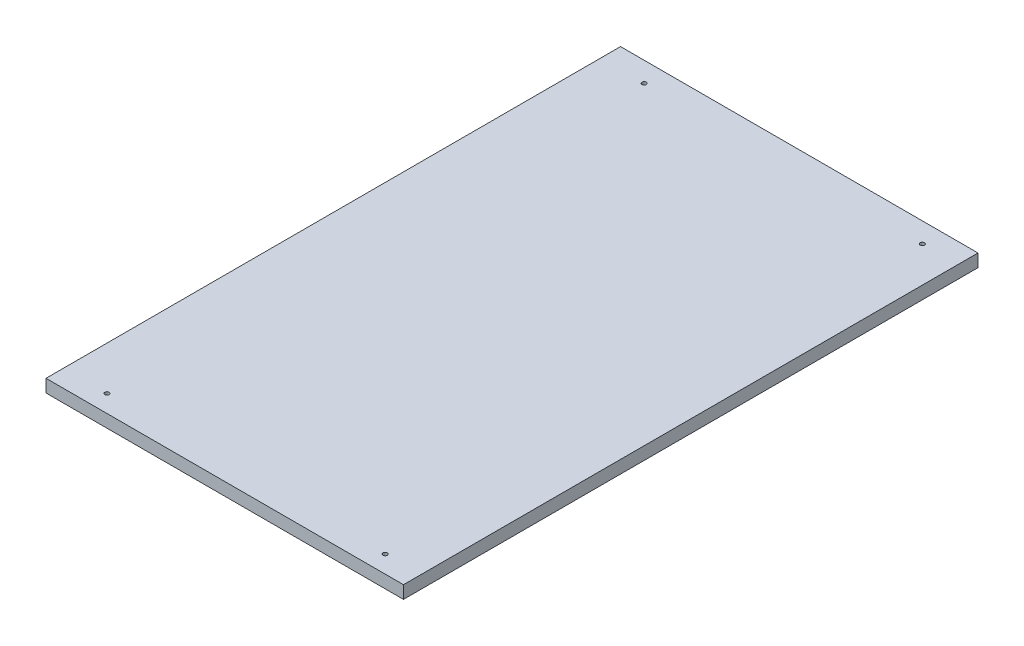
ISO-10303-21;
HEADER;
FILE_DESCRIPTION(('STEP AP214'),'2;1');
FILE_NAME('part.step','',(''),(''),'','','');
FILE_SCHEMA(('AUTOMOTIVE_DESIGN { 1 0 10303 214 1 1 1 1 }'));
ENDSEC;
DATA;
#1=APPLICATION_CONTEXT('core data for automotive mechanical design processes');
#2=APPLICATION_PROTOCOL_DEFINITION('international standard','automotive_design',2000,#1);
#3=PRODUCT_CONTEXT('',#1,'mechanical');
#4=PRODUCT('Part','Part','',(#3));
#5=PRODUCT_RELATED_PRODUCT_CATEGORY('part','',(#4));
#6=PRODUCT_DEFINITION_FORMATION('','',#4);
#7=PRODUCT_DEFINITION_CONTEXT('part definition',#1,'design');
#8=PRODUCT_DEFINITION('design','',#6,#7);
#9=PRODUCT_DEFINITION_SHAPE('','',#8);
#10=(LENGTH_UNIT() NAMED_UNIT(*) SI_UNIT(.MILLI.,.METRE.));
#11=(NAMED_UNIT(*) PLANE_ANGLE_UNIT() SI_UNIT($,.RADIAN.));
#12=(NAMED_UNIT(*) SI_UNIT($,.STERADIAN.) SOLID_ANGLE_UNIT());
#13=UNCERTAINTY_MEASURE_WITH_UNIT(LENGTH_MEASURE(1.E-05),#10,'distance_accuracy_value','');
#14=(GEOMETRIC_REPRESENTATION_CONTEXT(3) GLOBAL_UNCERTAINTY_ASSIGNED_CONTEXT((#13)) GLOBAL_UNIT_ASSIGNED_CONTEXT((#10,
#11,#12)) REPRESENTATION_CONTEXT('',''));
#15=CARTESIAN_POINT('',(0.,0.,0.));
#16=DIRECTION('',(0.,0.,1.));
#17=DIRECTION('',(1.,0.,0.));
#18=AXIS2_PLACEMENT_3D('',#15,#16,#17);
#19=CARTESIAN_POINT('',(42.,3.,-67.5));
#20=DIRECTION('',(-1.,0.,0.));
#21=DIRECTION('',(0.,0.,1.));
#22=AXIS2_PLACEMENT_3D('',#19,#20,#21);
#23=PLANE('',#22);
#24=DIRECTION('',(0.,0.,-1.));
#25=VECTOR('',#24,1.);
#26=CARTESIAN_POINT('',(42.,0.,-67.5));
#27=LINE('',#26,#25);
#28=CARTESIAN_POINT('',(42.,0.,67.5));
#29=VERTEX_POINT('',#28);
#30=CARTESIAN_POINT('',(42.,0.,-67.5));
#31=VERTEX_POINT('',#30);
#32=EDGE_CURVE('E98',#29,#31,#27,.T.);
#33=ORIENTED_EDGE('',*,*,#32,.T.);
#34=DIRECTION('',(0.,-1.,0.));
#35=VECTOR('',#34,1.);
#36=CARTESIAN_POINT('',(42.,3.,-67.5));
#37=LINE('',#36,#35);
#38=CARTESIAN_POINT('',(42.,3.,-67.5));
#39=VERTEX_POINT('',#38);
#40=EDGE_CURVE('E11',#39,#31,#37,.T.);
#41=ORIENTED_EDGE('',*,*,#40,.F.);
#42=DIRECTION('',(0.,0.,-1.));
#43=VECTOR('',#42,1.);
#44=CARTESIAN_POINT('',(42.,3.,-67.5));
#45=LINE('',#44,#43);
#46=CARTESIAN_POINT('',(42.,3.,67.5));
#47=VERTEX_POINT('',#46);
#48=EDGE_CURVE('E86',#47,#39,#45,.T.);
#49=ORIENTED_EDGE('',*,*,#48,.F.);
#50=DIRECTION('',(0.,-1.,0.));
#51=VECTOR('',#50,1.);
#52=CARTESIAN_POINT('',(42.,3.,67.5));
#53=LINE('',#52,#51);
#54=EDGE_CURVE('E94',#47,#29,#53,.T.);
#55=ORIENTED_EDGE('',*,*,#54,.T.);
#56=EDGE_LOOP('',(#33,#41,#49,#55));
#57=FACE_BOUND('',#56,.T.);
#58=ADVANCED_FACE('F35',(#57),#23,.F.);
#59=CARTESIAN_POINT('',(-42.,3.,-67.5));
#60=DIRECTION('',(0.,0.,1.));
#61=DIRECTION('',(1.,0.,0.));
#62=AXIS2_PLACEMENT_3D('',#59,#60,#61);
#63=PLANE('',#62);
#64=DIRECTION('',(-1.,0.,0.));
#65=VECTOR('',#64,1.);
#66=CARTESIAN_POINT('',(-42.,0.,-67.5));
#67=LINE('',#66,#65);
#68=CARTESIAN_POINT('',(-42.,0.,-67.5));
#69=VERTEX_POINT('',#68);
#70=EDGE_CURVE('E90',#31,#69,#67,.T.);
#71=ORIENTED_EDGE('',*,*,#70,.T.);
#72=DIRECTION('',(0.,-1.,0.));
#73=VECTOR('',#72,1.);
#74=CARTESIAN_POINT('',(-42.,3.,-67.5));
#75=LINE('',#74,#73);
#76=CARTESIAN_POINT('',(-42.,3.,-67.5));
#77=VERTEX_POINT('',#76);
#78=EDGE_CURVE('E43',#77,#69,#75,.T.);
#79=ORIENTED_EDGE('',*,*,#78,.F.);
#80=DIRECTION('',(-1.,0.,0.));
#81=VECTOR('',#80,1.);
#82=CARTESIAN_POINT('',(-42.,3.,-67.5));
#83=LINE('',#82,#81);
#84=EDGE_CURVE('E81',#39,#77,#83,.T.);
#85=ORIENTED_EDGE('',*,*,#84,.F.);
#86=ORIENTED_EDGE('',*,*,#40,.T.);
#87=EDGE_LOOP('',(#71,#79,#85,#86));
#88=FACE_BOUND('',#87,.T.);
#89=ADVANCED_FACE('F89',(#88),#63,.F.);
#90=CARTESIAN_POINT('',(-42.,3.,-67.5));
#91=DIRECTION('',(1.,0.,0.));
#92=DIRECTION('',(0.,0.,-1.));
#93=AXIS2_PLACEMENT_3D('',#90,#91,#92);
#94=PLANE('',#93);
#95=DIRECTION('',(0.,0.,1.));
#96=VECTOR('',#95,1.);
#97=CARTESIAN_POINT('',(-42.,0.,-67.5));
#98=LINE('',#97,#96);
#99=CARTESIAN_POINT('',(-42.,0.,67.5));
#100=VERTEX_POINT('',#99);
#101=EDGE_CURVE('E68',#69,#100,#98,.T.);
#102=ORIENTED_EDGE('',*,*,#101,.T.);
#103=DIRECTION('',(0.,-1.,0.));
#104=VECTOR('',#103,1.);
#105=CARTESIAN_POINT('',(-42.,3.,67.5));
#106=LINE('',#105,#104);
#107=CARTESIAN_POINT('',(-42.,3.,67.5));
#108=VERTEX_POINT('',#107);
#109=EDGE_CURVE('E91',#108,#100,#106,.T.);
#110=ORIENTED_EDGE('',*,*,#109,.F.);
#111=DIRECTION('',(0.,0.,1.));
#112=VECTOR('',#111,1.);
#113=CARTESIAN_POINT('',(-42.,3.,-67.5));
#114=LINE('',#113,#112);
#115=EDGE_CURVE('E84',#77,#108,#114,.T.);
#116=ORIENTED_EDGE('',*,*,#115,.F.);
#117=ORIENTED_EDGE('',*,*,#78,.T.);
#118=EDGE_LOOP('',(#102,#110,#116,#117));
#119=FACE_BOUND('',#118,.T.);
#120=ADVANCED_FACE('F92',(#119),#94,.F.);
#121=CARTESIAN_POINT('',(42.,3.,67.5));
#122=DIRECTION('',(0.,0.,-1.));
#123=DIRECTION('',(-1.,0.,0.));
#124=AXIS2_PLACEMENT_3D('',#121,#122,#123);
#125=PLANE('',#124);
#126=DIRECTION('',(1.,0.,0.));
#127=VECTOR('',#126,1.);
#128=CARTESIAN_POINT('',(42.,0.,67.5));
#129=LINE('',#128,#127);
#130=EDGE_CURVE('E74',#100,#29,#129,.T.);
#131=ORIENTED_EDGE('',*,*,#130,.T.);
#132=ORIENTED_EDGE('',*,*,#54,.F.);
#133=DIRECTION('',(1.,0.,0.));
#134=VECTOR('',#133,1.);
#135=CARTESIAN_POINT('',(42.,3.,67.5));
#136=LINE('',#135,#134);
#137=EDGE_CURVE('E51',#108,#47,#136,.T.);
#138=ORIENTED_EDGE('',*,*,#137,.F.);
#139=ORIENTED_EDGE('',*,*,#109,.T.);
#140=EDGE_LOOP('',(#131,#132,#138,#139));
#141=FACE_BOUND('',#140,.T.);
#142=ADVANCED_FACE('F106',(#141),#125,.F.);
#143=CARTESIAN_POINT('',(0.,3.,0.));
#144=DIRECTION('',(0.,-1.,0.));
#145=DIRECTION('',(0.,0.,-1.));
#146=AXIS2_PLACEMENT_3D('',#143,#144,#145);
#147=PLANE('',#146);
#148=CARTESIAN_POINT('',(-31.749623822275,3.,-62.8017403858609));
#149=DIRECTION('',(0.,1.,0.));
#150=DIRECTION('',(0.,0.,1.));
#151=AXIS2_PLACEMENT_3D('',#148,#149,#150);
#152=CIRCLE('',#151,0.49999999999999);
#153=CARTESIAN_POINT('',(-31.749623822275,3.,-62.3017403858609));
#154=VERTEX_POINT('',#153);
#155=EDGE_CURVE('E132',#154,#154,#152,.T.);
#156=ORIENTED_EDGE('',*,*,#155,.F.);
#157=EDGE_LOOP('',(#156));
#158=FACE_BOUND('',#157,.T.);
#159=CARTESIAN_POINT('',(33.6216198111213,3.,-62.8017403858609));
#160=DIRECTION('',(0.,1.,0.));
#161=DIRECTION('',(0.,0.,1.));
#162=AXIS2_PLACEMENT_3D('',#159,#160,#161);
#163=CIRCLE('',#162,0.499999999999987);
#164=CARTESIAN_POINT('',(33.6216198111213,3.,-62.3017403858609));
#165=VERTEX_POINT('',#164);
#166=EDGE_CURVE('E126',#165,#165,#163,.T.);
#167=ORIENTED_EDGE('',*,*,#166,.F.);
#168=EDGE_LOOP('',(#167));
#169=FACE_BOUND('',#168,.T.);
#170=CARTESIAN_POINT('',(-31.749623822275,3.,63.4292950779768));
#171=DIRECTION('',(0.,1.,0.));
#172=DIRECTION('',(0.,0.,1.));
#173=AXIS2_PLACEMENT_3D('',#170,#171,#172);
#174=CIRCLE('',#173,0.49999999999999);
#175=CARTESIAN_POINT('',(-31.749623822275,3.,63.9292950779768));
#176=VERTEX_POINT('',#175);
#177=EDGE_CURVE('E120',#176,#176,#174,.T.);
#178=ORIENTED_EDGE('',*,*,#177,.F.);
#179=EDGE_LOOP('',(#178));
#180=FACE_BOUND('',#179,.T.);
#181=CARTESIAN_POINT('',(33.6216198111213,3.,63.4292950779768));
#182=DIRECTION('',(0.,1.,0.));
#183=DIRECTION('',(0.,0.,1.));
#184=AXIS2_PLACEMENT_3D('',#181,#182,#183);
#185=CIRCLE('',#184,0.499999999999987);
#186=CARTESIAN_POINT('',(33.6216198111213,3.,63.9292950779768));
#187=VERTEX_POINT('',#186);
#188=EDGE_CURVE('E114',#187,#187,#185,.T.);
#189=ORIENTED_EDGE('',*,*,#188,.F.);
#190=EDGE_LOOP('',(#189));
#191=FACE_BOUND('',#190,.T.);
#192=ORIENTED_EDGE('',*,*,#48,.T.);
#193=ORIENTED_EDGE('',*,*,#84,.T.);
#194=ORIENTED_EDGE('',*,*,#115,.T.);
#195=ORIENTED_EDGE('',*,*,#137,.T.);
#196=EDGE_LOOP('',(#192,#193,#194,#195));
#197=FACE_BOUND('',#196,.T.);
#198=ADVANCED_FACE('F82',(#158,#169,#180,#191,#197),#147,.F.);
#199=CARTESIAN_POINT('',(0.,0.,0.));
#200=DIRECTION('',(0.,-1.,0.));
#201=DIRECTION('',(0.,0.,-1.));
#202=AXIS2_PLACEMENT_3D('',#199,#200,#201);
#203=PLANE('',#202);
#204=CARTESIAN_POINT('',(-31.749623822275,0.,-62.8017403858609));
#205=DIRECTION('',(0.,1.,0.));
#206=DIRECTION('',(0.,0.,1.));
#207=AXIS2_PLACEMENT_3D('',#204,#205,#206);
#208=CIRCLE('',#207,0.499999999999987);
#209=CARTESIAN_POINT('',(-31.749623822275,0.,-62.3017403858609));
#210=VERTEX_POINT('',#209);
#211=EDGE_CURVE('E129',#210,#210,#208,.T.);
#212=ORIENTED_EDGE('',*,*,#211,.T.);
#213=EDGE_LOOP('',(#212));
#214=FACE_BOUND('',#213,.T.);
#215=CARTESIAN_POINT('',(33.6216198111213,0.,-62.8017403858609));
#216=DIRECTION('',(0.,1.,0.));
#217=DIRECTION('',(0.,0.,1.));
#218=AXIS2_PLACEMENT_3D('',#215,#216,#217);
#219=CIRCLE('',#218,0.499999999999987);
#220=CARTESIAN_POINT('',(33.6216198111213,0.,-62.3017403858609));
#221=VERTEX_POINT('',#220);
#222=EDGE_CURVE('E123',#221,#221,#219,.T.);
#223=ORIENTED_EDGE('',*,*,#222,.T.);
#224=EDGE_LOOP('',(#223));
#225=FACE_BOUND('',#224,.T.);
#226=CARTESIAN_POINT('',(-31.749623822275,0.,63.4292950779768));
#227=DIRECTION('',(0.,1.,0.));
#228=DIRECTION('',(0.,0.,1.));
#229=AXIS2_PLACEMENT_3D('',#226,#227,#228);
#230=CIRCLE('',#229,0.499999999999987);
#231=CARTESIAN_POINT('',(-31.749623822275,0.,63.9292950779768));
#232=VERTEX_POINT('',#231);
#233=EDGE_CURVE('E117',#232,#232,#230,.T.);
#234=ORIENTED_EDGE('',*,*,#233,.T.);
#235=EDGE_LOOP('',(#234));
#236=FACE_BOUND('',#235,.T.);
#237=CARTESIAN_POINT('',(33.6216198111213,0.,63.4292950779768));
#238=DIRECTION('',(0.,1.,0.));
#239=DIRECTION('',(0.,0.,1.));
#240=AXIS2_PLACEMENT_3D('',#237,#238,#239);
#241=CIRCLE('',#240,0.499999999999987);
#242=CARTESIAN_POINT('',(33.6216198111213,0.,63.9292950779768));
#243=VERTEX_POINT('',#242);
#244=EDGE_CURVE('E101',#243,#243,#241,.T.);
#245=ORIENTED_EDGE('',*,*,#244,.T.);
#246=EDGE_LOOP('',(#245));
#247=FACE_BOUND('',#246,.T.);
#248=ORIENTED_EDGE('',*,*,#32,.F.);
#249=ORIENTED_EDGE('',*,*,#130,.F.);
#250=ORIENTED_EDGE('',*,*,#101,.F.);
#251=ORIENTED_EDGE('',*,*,#70,.F.);
#252=EDGE_LOOP('',(#248,#249,#250,#251));
#253=FACE_BOUND('',#252,.T.);
#254=ADVANCED_FACE('F109',(#214,#225,#236,#247,#253),#203,.T.);
#255=CARTESIAN_POINT('',(33.6216198111213,3.,63.4292950779768));
#256=DIRECTION('',(0.,1.,0.));
#257=DIRECTION('',(0.,0.,1.));
#258=AXIS2_PLACEMENT_3D('',#255,#256,#257);
#259=CYLINDRICAL_SURFACE('',#258,0.499999999999987);
#260=ORIENTED_EDGE('',*,*,#244,.F.);
#261=EDGE_LOOP('',(#260));
#262=FACE_BOUND('',#261,.T.);
#263=ORIENTED_EDGE('',*,*,#188,.T.);
#264=EDGE_LOOP('',(#263));
#265=FACE_BOUND('',#264,.T.);
#266=ADVANCED_FACE('F147',(#262,#265),#259,.F.);
#267=CARTESIAN_POINT('',(-31.749623822275,3.,63.4292950779768));
#268=DIRECTION('',(0.,1.,0.));
#269=DIRECTION('',(0.,0.,1.));
#270=AXIS2_PLACEMENT_3D('',#267,#268,#269);
#271=CYLINDRICAL_SURFACE('',#270,0.499999999999988);
#272=ORIENTED_EDGE('',*,*,#233,.F.);
#273=EDGE_LOOP('',(#272));
#274=FACE_BOUND('',#273,.T.);
#275=ORIENTED_EDGE('',*,*,#177,.T.);
#276=EDGE_LOOP('',(#275));
#277=FACE_BOUND('',#276,.T.);
#278=ADVANCED_FACE('F149',(#274,#277),#271,.F.);
#279=CARTESIAN_POINT('',(33.6216198111213,3.,-62.8017403858609));
#280=DIRECTION('',(0.,1.,0.));
#281=DIRECTION('',(0.,0.,1.));
#282=AXIS2_PLACEMENT_3D('',#279,#280,#281);
#283=CYLINDRICAL_SURFACE('',#282,0.499999999999987);
#284=ORIENTED_EDGE('',*,*,#222,.F.);
#285=EDGE_LOOP('',(#284));
#286=FACE_BOUND('',#285,.T.);
#287=ORIENTED_EDGE('',*,*,#166,.T.);
#288=EDGE_LOOP('',(#287));
#289=FACE_BOUND('',#288,.T.);
#290=ADVANCED_FACE('F156',(#286,#289),#283,.F.);
#291=CARTESIAN_POINT('',(-31.749623822275,3.,-62.8017403858609));
#292=DIRECTION('',(0.,1.,0.));
#293=DIRECTION('',(0.,0.,1.));
#294=AXIS2_PLACEMENT_3D('',#291,#292,#293);
#295=CYLINDRICAL_SURFACE('',#294,0.499999999999988);
#296=ORIENTED_EDGE('',*,*,#211,.F.);
#297=EDGE_LOOP('',(#296));
#298=FACE_BOUND('',#297,.T.);
#299=ORIENTED_EDGE('',*,*,#155,.T.);
#300=EDGE_LOOP('',(#299));
#301=FACE_BOUND('',#300,.T.);
#302=ADVANCED_FACE('F136',(#298,#301),#295,.F.);
#303=CLOSED_SHELL('',(#58,#89,#120,#142,#198,#254,#266,#278,#290,#302));
#304=MANIFOLD_SOLID_BREP('B2',#303);
#305=ADVANCED_BREP_SHAPE_REPRESENTATION('',(#18,#304),#14);
#306=SHAPE_DEFINITION_REPRESENTATION(#9,#305);
ENDSEC;
END-ISO-10303-21;
